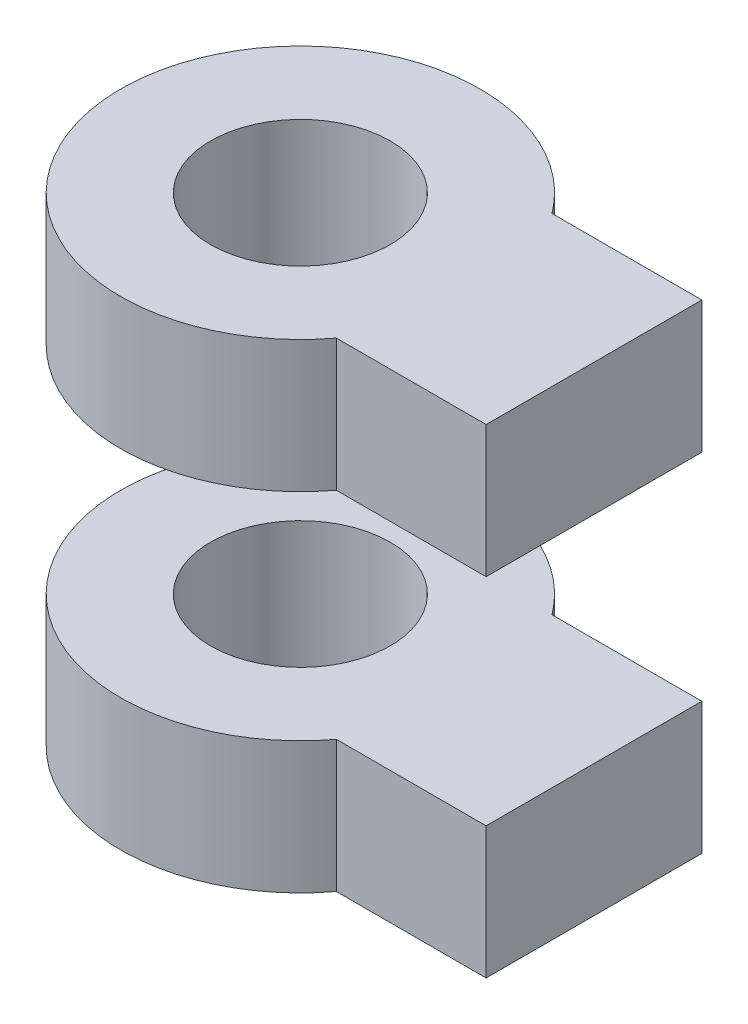
ISO-10303-21;
HEADER;
FILE_DESCRIPTION(('STEP AP214'),'2;1');
FILE_NAME('part.step','',(''),(''),'','','');
FILE_SCHEMA(('AUTOMOTIVE_DESIGN { 1 0 10303 214 1 1 1 1 }'));
ENDSEC;
DATA;
#1=APPLICATION_CONTEXT('core data for automotive mechanical design processes');
#2=APPLICATION_PROTOCOL_DEFINITION('international standard','automotive_design',2000,#1);
#3=PRODUCT_CONTEXT('',#1,'mechanical');
#4=PRODUCT('Part','Part','',(#3));
#5=PRODUCT_RELATED_PRODUCT_CATEGORY('part','',(#4));
#6=PRODUCT_DEFINITION_FORMATION('','',#4);
#7=PRODUCT_DEFINITION_CONTEXT('part definition',#1,'design');
#8=PRODUCT_DEFINITION('design','',#6,#7);
#9=PRODUCT_DEFINITION_SHAPE('','',#8);
#10=(LENGTH_UNIT() NAMED_UNIT(*) SI_UNIT(.MILLI.,.METRE.));
#11=(NAMED_UNIT(*) PLANE_ANGLE_UNIT() SI_UNIT($,.RADIAN.));
#12=(NAMED_UNIT(*) SI_UNIT($,.STERADIAN.) SOLID_ANGLE_UNIT());
#13=UNCERTAINTY_MEASURE_WITH_UNIT(LENGTH_MEASURE(1.E-05),#10,'distance_accuracy_value','');
#14=(GEOMETRIC_REPRESENTATION_CONTEXT(3) GLOBAL_UNCERTAINTY_ASSIGNED_CONTEXT((#13)) GLOBAL_UNIT_ASSIGNED_CONTEXT((#10,
#11,#12)) REPRESENTATION_CONTEXT('',''));
#15=CARTESIAN_POINT('',(0.,0.,0.));
#16=DIRECTION('',(0.,0.,1.));
#17=DIRECTION('',(1.,0.,0.));
#18=AXIS2_PLACEMENT_3D('',#15,#16,#17);
#19=CARTESIAN_POINT('',(0.,40.,0.));
#20=DIRECTION('',(0.,-1.,0.));
#21=DIRECTION('',(0.,0.,-1.));
#22=AXIS2_PLACEMENT_3D('',#19,#20,#21);
#23=CYLINDRICAL_SURFACE('',#22,30.);
#24=DIRECTION('',(0.,-1.,0.));
#25=VECTOR('',#24,1.);
#26=CARTESIAN_POINT('',(24.,40.,-18.));
#27=LINE('',#26,#25);
#28=CARTESIAN_POINT('',(24.,40.,-18.));
#29=VERTEX_POINT('',#28);
#30=CARTESIAN_POINT('',(24.,18.,-18.));
#31=VERTEX_POINT('',#30);
#32=EDGE_CURVE('E53',#29,#31,#27,.T.);
#33=ORIENTED_EDGE('',*,*,#32,.T.);
#34=CARTESIAN_POINT('',(0.,18.,0.));
#35=DIRECTION('',(0.,1.,0.));
#36=DIRECTION('',(0.,0.,1.));
#37=AXIS2_PLACEMENT_3D('',#34,#35,#36);
#38=CIRCLE('',#37,30.);
#39=CARTESIAN_POINT('',(24.,18.,18.));
#40=VERTEX_POINT('',#39);
#41=EDGE_CURVE('E68',#31,#40,#38,.T.);
#42=ORIENTED_EDGE('',*,*,#41,.T.);
#43=DIRECTION('',(0.,-1.,0.));
#44=VECTOR('',#43,1.);
#45=CARTESIAN_POINT('',(24.,40.,18.));
#46=LINE('',#45,#44);
#47=CARTESIAN_POINT('',(24.,40.,18.));
#48=VERTEX_POINT('',#47);
#49=EDGE_CURVE('E110',#48,#40,#46,.T.);
#50=ORIENTED_EDGE('',*,*,#49,.F.);
#51=CARTESIAN_POINT('',(0.,40.,0.));
#52=DIRECTION('',(0.,1.,0.));
#53=DIRECTION('',(0.,0.,1.));
#54=AXIS2_PLACEMENT_3D('',#51,#52,#53);
#55=CIRCLE('',#54,30.);
#56=EDGE_CURVE('E117',#29,#48,#55,.T.);
#57=ORIENTED_EDGE('',*,*,#56,.F.);
#58=EDGE_LOOP('',(#33,#42,#50,#57));
#59=FACE_BOUND('',#58,.T.);
#60=ADVANCED_FACE('F49',(#59),#23,.T.);
#61=CARTESIAN_POINT('',(24.,40.,18.));
#62=DIRECTION('',(0.,0.,-1.));
#63=DIRECTION('',(-1.,0.,0.));
#64=AXIS2_PLACEMENT_3D('',#61,#62,#63);
#65=PLANE('',#64);
#66=ORIENTED_EDGE('',*,*,#49,.T.);
#67=DIRECTION('',(1.,0.,0.));
#68=VECTOR('',#67,1.);
#69=CARTESIAN_POINT('',(24.,18.,18.));
#70=LINE('',#69,#68);
#71=CARTESIAN_POINT('',(49.,18.,18.));
#72=VERTEX_POINT('',#71);
#73=EDGE_CURVE('E109',#40,#72,#70,.T.);
#74=ORIENTED_EDGE('',*,*,#73,.T.);
#75=DIRECTION('',(0.,-1.,0.));
#76=VECTOR('',#75,1.);
#77=CARTESIAN_POINT('',(49.,40.,18.));
#78=LINE('',#77,#76);
#79=CARTESIAN_POINT('',(49.,40.,18.));
#80=VERTEX_POINT('',#79);
#81=EDGE_CURVE('E104',#80,#72,#78,.T.);
#82=ORIENTED_EDGE('',*,*,#81,.F.);
#83=DIRECTION('',(1.,0.,0.));
#84=VECTOR('',#83,1.);
#85=CARTESIAN_POINT('',(24.,40.,18.));
#86=LINE('',#85,#84);
#87=EDGE_CURVE('E120',#48,#80,#86,.T.);
#88=ORIENTED_EDGE('',*,*,#87,.F.);
#89=EDGE_LOOP('',(#66,#74,#82,#88));
#90=FACE_BOUND('',#89,.T.);
#91=ADVANCED_FACE('F131',(#90),#65,.F.);
#92=CARTESIAN_POINT('',(49.,40.,18.));
#93=DIRECTION('',(-1.,0.,0.));
#94=DIRECTION('',(0.,0.,1.));
#95=AXIS2_PLACEMENT_3D('',#92,#93,#94);
#96=PLANE('',#95);
#97=ORIENTED_EDGE('',*,*,#81,.T.);
#98=DIRECTION('',(0.,0.,-1.));
#99=VECTOR('',#98,1.);
#100=CARTESIAN_POINT('',(49.,18.,18.));
#101=LINE('',#100,#99);
#102=CARTESIAN_POINT('',(49.,18.,-18.));
#103=VERTEX_POINT('',#102);
#104=EDGE_CURVE('E86',#72,#103,#101,.T.);
#105=ORIENTED_EDGE('',*,*,#104,.T.);
#106=DIRECTION('',(0.,-1.,0.));
#107=VECTOR('',#106,1.);
#108=CARTESIAN_POINT('',(49.,40.,-18.));
#109=LINE('',#108,#107);
#110=CARTESIAN_POINT('',(49.,40.,-18.));
#111=VERTEX_POINT('',#110);
#112=EDGE_CURVE('E95',#111,#103,#109,.T.);
#113=ORIENTED_EDGE('',*,*,#112,.F.);
#114=DIRECTION('',(0.,0.,-1.));
#115=VECTOR('',#114,1.);
#116=CARTESIAN_POINT('',(49.,40.,18.));
#117=LINE('',#116,#115);
#118=EDGE_CURVE('E122',#80,#111,#117,.T.);
#119=ORIENTED_EDGE('',*,*,#118,.F.);
#120=EDGE_LOOP('',(#97,#105,#113,#119));
#121=FACE_BOUND('',#120,.T.);
#122=ADVANCED_FACE('F100',(#121),#96,.F.);
#123=CARTESIAN_POINT('',(24.,40.,-18.));
#124=DIRECTION('',(0.,0.,1.));
#125=DIRECTION('',(1.,0.,0.));
#126=AXIS2_PLACEMENT_3D('',#123,#124,#125);
#127=PLANE('',#126);
#128=ORIENTED_EDGE('',*,*,#112,.T.);
#129=DIRECTION('',(-1.,0.,0.));
#130=VECTOR('',#129,1.);
#131=CARTESIAN_POINT('',(24.,18.,-18.));
#132=LINE('',#131,#130);
#133=EDGE_CURVE('E88',#103,#31,#132,.T.);
#134=ORIENTED_EDGE('',*,*,#133,.T.);
#135=ORIENTED_EDGE('',*,*,#32,.F.);
#136=DIRECTION('',(-1.,0.,0.));
#137=VECTOR('',#136,1.);
#138=CARTESIAN_POINT('',(24.,40.,-18.));
#139=LINE('',#138,#137);
#140=EDGE_CURVE('E59',#111,#29,#139,.T.);
#141=ORIENTED_EDGE('',*,*,#140,.F.);
#142=EDGE_LOOP('',(#128,#134,#135,#141));
#143=FACE_BOUND('',#142,.T.);
#144=ADVANCED_FACE('F106',(#143),#127,.F.);
#145=CARTESIAN_POINT('',(0.,40.,0.));
#146=DIRECTION('',(0.,-1.,0.));
#147=DIRECTION('',(0.,0.,-1.));
#148=AXIS2_PLACEMENT_3D('',#145,#146,#147);
#149=CYLINDRICAL_SURFACE('',#148,15.);
#150=CARTESIAN_POINT('',(0.,18.,0.));
#151=DIRECTION('',(0.,1.,0.));
#152=DIRECTION('',(0.,0.,1.));
#153=AXIS2_PLACEMENT_3D('',#150,#151,#152);
#154=CIRCLE('',#153,15.);
#155=CARTESIAN_POINT('',(0.,18.,15.));
#156=VERTEX_POINT('',#155);
#157=EDGE_CURVE('E12',#156,#156,#154,.T.);
#158=ORIENTED_EDGE('',*,*,#157,.F.);
#159=EDGE_LOOP('',(#158));
#160=FACE_BOUND('',#159,.T.);
#161=CARTESIAN_POINT('',(0.,40.,0.));
#162=DIRECTION('',(0.,1.,0.));
#163=DIRECTION('',(0.,0.,1.));
#164=AXIS2_PLACEMENT_3D('',#161,#162,#163);
#165=CIRCLE('',#164,15.);
#166=CARTESIAN_POINT('',(0.,40.,15.));
#167=VERTEX_POINT('',#166);
#168=EDGE_CURVE('E94',#167,#167,#165,.T.);
#169=ORIENTED_EDGE('',*,*,#168,.T.);
#170=EDGE_LOOP('',(#169));
#171=FACE_BOUND('',#170,.T.);
#172=ADVANCED_FACE('F51',(#160,#171),#149,.F.);
#173=CARTESIAN_POINT('',(0.,40.,0.));
#174=DIRECTION('',(0.,1.,0.));
#175=DIRECTION('',(0.,0.,1.));
#176=AXIS2_PLACEMENT_3D('',#173,#174,#175);
#177=PLANE('',#176);
#178=ORIENTED_EDGE('',*,*,#56,.T.);
#179=ORIENTED_EDGE('',*,*,#87,.T.);
#180=ORIENTED_EDGE('',*,*,#118,.T.);
#181=ORIENTED_EDGE('',*,*,#140,.T.);
#182=EDGE_LOOP('',(#178,#179,#180,#181));
#183=FACE_BOUND('',#182,.T.);
#184=ORIENTED_EDGE('',*,*,#168,.F.);
#185=EDGE_LOOP('',(#184));
#186=FACE_BOUND('',#185,.T.);
#187=ADVANCED_FACE('F125',(#183,#186),#177,.T.);
#188=CARTESIAN_POINT('',(-34.143517344795,18.,-40.));
#189=DIRECTION('',(0.,1.,0.));
#190=DIRECTION('',(0.,0.,1.));
#191=AXIS2_PLACEMENT_3D('',#188,#189,#190);
#192=PLANE('',#191);
#193=ORIENTED_EDGE('',*,*,#157,.T.);
#194=EDGE_LOOP('',(#193));
#195=FACE_BOUND('',#194,.T.);
#196=ORIENTED_EDGE('',*,*,#133,.F.);
#197=ORIENTED_EDGE('',*,*,#104,.F.);
#198=ORIENTED_EDGE('',*,*,#73,.F.);
#199=ORIENTED_EDGE('',*,*,#41,.F.);
#200=EDGE_LOOP('',(#196,#197,#198,#199));
#201=FACE_BOUND('',#200,.T.);
#202=ADVANCED_FACE('F89',(#195,#201),#192,.F.);
#203=CLOSED_SHELL('',(#60,#91,#122,#144,#172,#187,#202));
#204=MANIFOLD_SOLID_BREP('B2',#203);
#205=CARTESIAN_POINT('',(24.,40.,-18.));
#206=DIRECTION('',(0.,0.,1.));
#207=DIRECTION('',(1.,0.,0.));
#208=AXIS2_PLACEMENT_3D('',#205,#206,#207);
#209=PLANE('',#208);
#210=DIRECTION('',(0.,-1.,0.));
#211=VECTOR('',#210,1.);
#212=CARTESIAN_POINT('',(24.,40.,-18.));
#213=LINE('',#212,#211);
#214=CARTESIAN_POINT('',(24.,-18.,-18.));
#215=VERTEX_POINT('',#214);
#216=CARTESIAN_POINT('',(24.,-40.,-18.));
#217=VERTEX_POINT('',#216);
#218=EDGE_CURVE('E218',#215,#217,#213,.T.);
#219=ORIENTED_EDGE('',*,*,#218,.F.);
#220=DIRECTION('',(1.,0.,0.));
#221=VECTOR('',#220,1.);
#222=CARTESIAN_POINT('',(24.,-18.,-18.));
#223=LINE('',#222,#221);
#224=CARTESIAN_POINT('',(49.,-18.,-18.));
#225=VERTEX_POINT('',#224);
#226=EDGE_CURVE('E234',#215,#225,#223,.T.);
#227=ORIENTED_EDGE('',*,*,#226,.T.);
#228=DIRECTION('',(0.,-1.,0.));
#229=VECTOR('',#228,1.);
#230=CARTESIAN_POINT('',(49.,40.,-18.));
#231=LINE('',#230,#229);
#232=CARTESIAN_POINT('',(49.,-40.,-18.));
#233=VERTEX_POINT('',#232);
#234=EDGE_CURVE('E248',#225,#233,#231,.T.);
#235=ORIENTED_EDGE('',*,*,#234,.T.);
#236=DIRECTION('',(-1.,0.,0.));
#237=VECTOR('',#236,1.);
#238=CARTESIAN_POINT('',(24.,-40.,-18.));
#239=LINE('',#238,#237);
#240=EDGE_CURVE('E246',#233,#217,#239,.T.);
#241=ORIENTED_EDGE('',*,*,#240,.T.);
#242=EDGE_LOOP('',(#219,#227,#235,#241));
#243=FACE_BOUND('',#242,.T.);
#244=ADVANCED_FACE('F194',(#243),#209,.F.);
#245=CARTESIAN_POINT('',(49.,40.,18.));
#246=DIRECTION('',(-1.,0.,0.));
#247=DIRECTION('',(0.,0.,1.));
#248=AXIS2_PLACEMENT_3D('',#245,#246,#247);
#249=PLANE('',#248);
#250=ORIENTED_EDGE('',*,*,#234,.F.);
#251=DIRECTION('',(0.,0.,1.));
#252=VECTOR('',#251,1.);
#253=CARTESIAN_POINT('',(49.,-18.,18.));
#254=LINE('',#253,#252);
#255=CARTESIAN_POINT('',(49.,-18.,18.));
#256=VERTEX_POINT('',#255);
#257=EDGE_CURVE('E210',#225,#256,#254,.T.);
#258=ORIENTED_EDGE('',*,*,#257,.T.);
#259=DIRECTION('',(0.,-1.,0.));
#260=VECTOR('',#259,1.);
#261=CARTESIAN_POINT('',(49.,40.,18.));
#262=LINE('',#261,#260);
#263=CARTESIAN_POINT('',(49.,-40.,18.));
#264=VERTEX_POINT('',#263);
#265=EDGE_CURVE('E203',#256,#264,#262,.T.);
#266=ORIENTED_EDGE('',*,*,#265,.T.);
#267=DIRECTION('',(0.,0.,-1.));
#268=VECTOR('',#267,1.);
#269=CARTESIAN_POINT('',(49.,-40.,18.));
#270=LINE('',#269,#268);
#271=EDGE_CURVE('E251',#264,#233,#270,.T.);
#272=ORIENTED_EDGE('',*,*,#271,.T.);
#273=EDGE_LOOP('',(#250,#258,#266,#272));
#274=FACE_BOUND('',#273,.T.);
#275=ADVANCED_FACE('F259',(#274),#249,.F.);
#276=CARTESIAN_POINT('',(24.,40.,18.));
#277=DIRECTION('',(0.,0.,-1.));
#278=DIRECTION('',(-1.,0.,0.));
#279=AXIS2_PLACEMENT_3D('',#276,#277,#278);
#280=PLANE('',#279);
#281=ORIENTED_EDGE('',*,*,#265,.F.);
#282=DIRECTION('',(-1.,0.,0.));
#283=VECTOR('',#282,1.);
#284=CARTESIAN_POINT('',(24.,-18.,18.));
#285=LINE('',#284,#283);
#286=CARTESIAN_POINT('',(24.,-18.,18.));
#287=VERTEX_POINT('',#286);
#288=EDGE_CURVE('E243',#256,#287,#285,.T.);
#289=ORIENTED_EDGE('',*,*,#288,.T.);
#290=DIRECTION('',(0.,-1.,0.));
#291=VECTOR('',#290,1.);
#292=CARTESIAN_POINT('',(24.,40.,18.));
#293=LINE('',#292,#291);
#294=CARTESIAN_POINT('',(24.,-40.,18.));
#295=VERTEX_POINT('',#294);
#296=EDGE_CURVE('E47',#287,#295,#293,.T.);
#297=ORIENTED_EDGE('',*,*,#296,.T.);
#298=DIRECTION('',(1.,0.,0.));
#299=VECTOR('',#298,1.);
#300=CARTESIAN_POINT('',(24.,-40.,18.));
#301=LINE('',#300,#299);
#302=EDGE_CURVE('E263',#295,#264,#301,.T.);
#303=ORIENTED_EDGE('',*,*,#302,.T.);
#304=EDGE_LOOP('',(#281,#289,#297,#303));
#305=FACE_BOUND('',#304,.T.);
#306=ADVANCED_FACE('F264',(#305),#280,.F.);
#307=CARTESIAN_POINT('',(0.,40.,0.));
#308=DIRECTION('',(0.,-1.,0.));
#309=DIRECTION('',(0.,0.,-1.));
#310=AXIS2_PLACEMENT_3D('',#307,#308,#309);
#311=CYLINDRICAL_SURFACE('',#310,30.);
#312=ORIENTED_EDGE('',*,*,#296,.F.);
#313=CARTESIAN_POINT('',(0.,-18.,0.));
#314=DIRECTION('',(0.,-1.,0.));
#315=DIRECTION('',(0.,0.,-1.));
#316=AXIS2_PLACEMENT_3D('',#313,#314,#315);
#317=CIRCLE('',#316,30.);
#318=EDGE_CURVE('E236',#287,#215,#317,.T.);
#319=ORIENTED_EDGE('',*,*,#318,.T.);
#320=ORIENTED_EDGE('',*,*,#218,.T.);
#321=CARTESIAN_POINT('',(0.,-40.,0.));
#322=DIRECTION('',(0.,1.,0.));
#323=DIRECTION('',(0.,0.,1.));
#324=AXIS2_PLACEMENT_3D('',#321,#322,#323);
#325=CIRCLE('',#324,30.);
#326=EDGE_CURVE('E266',#217,#295,#325,.T.);
#327=ORIENTED_EDGE('',*,*,#326,.T.);
#328=EDGE_LOOP('',(#312,#319,#320,#327));
#329=FACE_BOUND('',#328,.T.);
#330=ADVANCED_FACE('F196',(#329),#311,.T.);
#331=CARTESIAN_POINT('',(0.,-40.,0.));
#332=DIRECTION('',(0.,1.,0.));
#333=DIRECTION('',(0.,0.,1.));
#334=AXIS2_PLACEMENT_3D('',#331,#332,#333);
#335=PLANE('',#334);
#336=ORIENTED_EDGE('',*,*,#326,.F.);
#337=ORIENTED_EDGE('',*,*,#240,.F.);
#338=ORIENTED_EDGE('',*,*,#271,.F.);
#339=ORIENTED_EDGE('',*,*,#302,.F.);
#340=EDGE_LOOP('',(#336,#337,#338,#339));
#341=FACE_BOUND('',#340,.T.);
#342=CARTESIAN_POINT('',(0.,-40.,0.));
#343=DIRECTION('',(0.,1.,0.));
#344=DIRECTION('',(0.,0.,1.));
#345=AXIS2_PLACEMENT_3D('',#342,#343,#344);
#346=CIRCLE('',#345,15.);
#347=CARTESIAN_POINT('',(0.,-40.,15.));
#348=VERTEX_POINT('',#347);
#349=EDGE_CURVE('E242',#348,#348,#346,.T.);
#350=ORIENTED_EDGE('',*,*,#349,.T.);
#351=EDGE_LOOP('',(#350));
#352=FACE_BOUND('',#351,.T.);
#353=ADVANCED_FACE('F268',(#341,#352),#335,.F.);
#354=CARTESIAN_POINT('',(0.,40.,0.));
#355=DIRECTION('',(0.,-1.,0.));
#356=DIRECTION('',(0.,0.,-1.));
#357=AXIS2_PLACEMENT_3D('',#354,#355,#356);
#358=CYLINDRICAL_SURFACE('',#357,15.);
#359=CARTESIAN_POINT('',(0.,-18.,0.));
#360=DIRECTION('',(0.,-1.,0.));
#361=DIRECTION('',(0.,0.,-1.));
#362=AXIS2_PLACEMENT_3D('',#359,#360,#361);
#363=CIRCLE('',#362,15.);
#364=CARTESIAN_POINT('',(0.,-18.,-15.));
#365=VERTEX_POINT('',#364);
#366=EDGE_CURVE('E198',#365,#365,#363,.T.);
#367=ORIENTED_EDGE('',*,*,#366,.F.);
#368=EDGE_LOOP('',(#367));
#369=FACE_BOUND('',#368,.T.);
#370=ORIENTED_EDGE('',*,*,#349,.F.);
#371=EDGE_LOOP('',(#370));
#372=FACE_BOUND('',#371,.T.);
#373=ADVANCED_FACE('F277',(#369,#372),#358,.F.);
#374=CARTESIAN_POINT('',(-34.143517344795,-18.,-40.));
#375=DIRECTION('',(0.,-1.,0.));
#376=DIRECTION('',(0.,0.,-1.));
#377=AXIS2_PLACEMENT_3D('',#374,#375,#376);
#378=PLANE('',#377);
#379=ORIENTED_EDGE('',*,*,#366,.T.);
#380=EDGE_LOOP('',(#379));
#381=FACE_BOUND('',#380,.T.);
#382=ORIENTED_EDGE('',*,*,#288,.F.);
#383=ORIENTED_EDGE('',*,*,#257,.F.);
#384=ORIENTED_EDGE('',*,*,#226,.F.);
#385=ORIENTED_EDGE('',*,*,#318,.F.);
#386=EDGE_LOOP('',(#382,#383,#384,#385));
#387=FACE_BOUND('',#386,.T.);
#388=ADVANCED_FACE('F235',(#381,#387),#378,.F.);
#389=CLOSED_SHELL('',(#244,#275,#306,#330,#353,#373,#388));
#390=MANIFOLD_SOLID_BREP('B6',#389);
#391=ADVANCED_BREP_SHAPE_REPRESENTATION('',(#18,#204,#390),#14);
#392=SHAPE_DEFINITION_REPRESENTATION(#9,#391);
ENDSEC;
END-ISO-10303-21;
